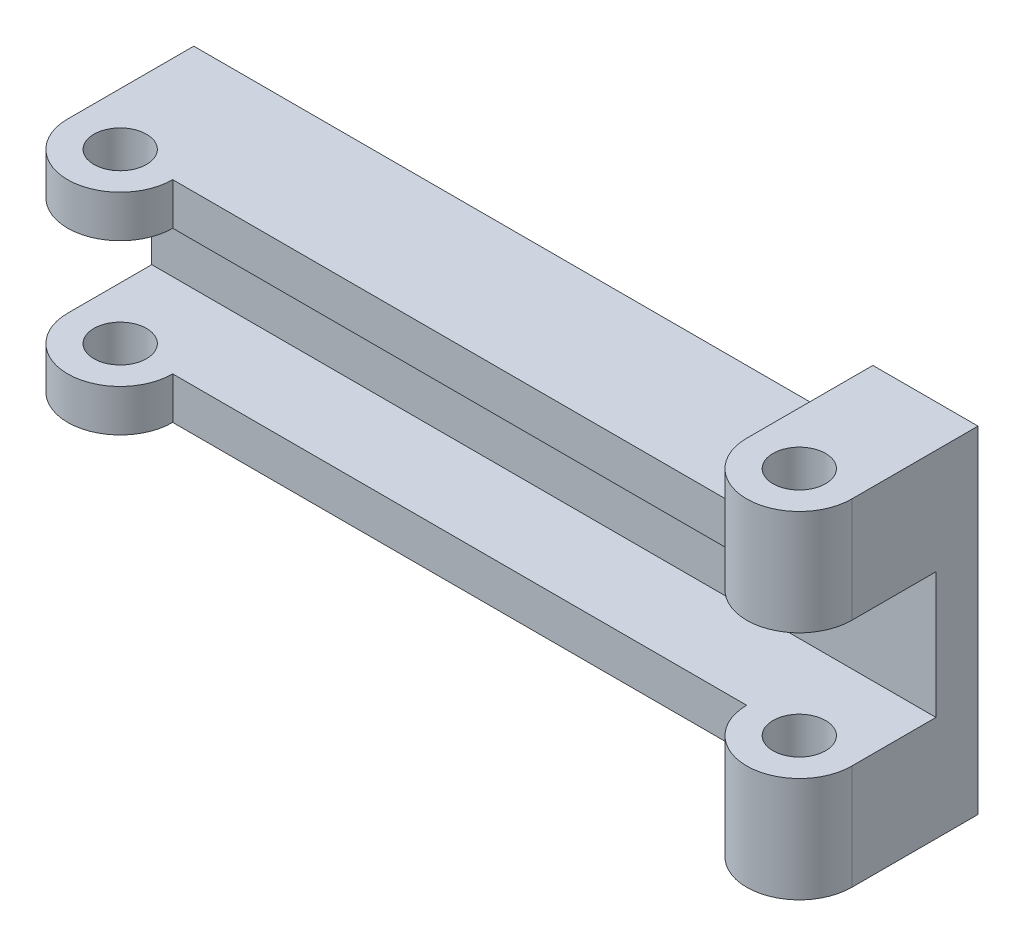
ISO-10303-21;
HEADER;
FILE_DESCRIPTION(('STEP AP214'),'2;1');
FILE_NAME('part.step','',(''),(''),'','','');
FILE_SCHEMA(('AUTOMOTIVE_DESIGN { 1 0 10303 214 1 1 1 1 }'));
ENDSEC;
DATA;
#1=APPLICATION_CONTEXT('core data for automotive mechanical design processes');
#2=APPLICATION_PROTOCOL_DEFINITION('international standard','automotive_design',2000,#1);
#3=PRODUCT_CONTEXT('',#1,'mechanical');
#4=PRODUCT('Part','Part','',(#3));
#5=PRODUCT_RELATED_PRODUCT_CATEGORY('part','',(#4));
#6=PRODUCT_DEFINITION_FORMATION('','',#4);
#7=PRODUCT_DEFINITION_CONTEXT('part definition',#1,'design');
#8=PRODUCT_DEFINITION('design','',#6,#7);
#9=PRODUCT_DEFINITION_SHAPE('','',#8);
#10=(LENGTH_UNIT() NAMED_UNIT(*) SI_UNIT(.MILLI.,.METRE.));
#11=(NAMED_UNIT(*) PLANE_ANGLE_UNIT() SI_UNIT($,.RADIAN.));
#12=(NAMED_UNIT(*) SI_UNIT($,.STERADIAN.) SOLID_ANGLE_UNIT());
#13=UNCERTAINTY_MEASURE_WITH_UNIT(LENGTH_MEASURE(1.E-05),#10,'distance_accuracy_value','');
#14=(GEOMETRIC_REPRESENTATION_CONTEXT(3) GLOBAL_UNCERTAINTY_ASSIGNED_CONTEXT((#13)) GLOBAL_UNIT_ASSIGNED_CONTEXT((#10,
#11,#12)) REPRESENTATION_CONTEXT('',''));
#15=CARTESIAN_POINT('',(0.,0.,0.));
#16=DIRECTION('',(0.,0.,1.));
#17=DIRECTION('',(1.,0.,0.));
#18=AXIS2_PLACEMENT_3D('',#15,#16,#17);
#19=CARTESIAN_POINT('',(102.5525,-15.875,6.35));
#20=DIRECTION('',(1.,0.,0.));
#21=DIRECTION('',(0.,0.,-1.));
#22=AXIS2_PLACEMENT_3D('',#19,#20,#21);
#23=PLANE('',#22);
#24=DIRECTION('',(0.,-1.,0.));
#25=VECTOR('',#24,1.);
#26=CARTESIAN_POINT('',(102.5525,-9.525,19.05));
#27=LINE('',#26,#25);
#28=CARTESIAN_POINT('',(102.5525,-15.875,19.05));
#29=VERTEX_POINT('',#28);
#30=CARTESIAN_POINT('',(102.5525,-25.4,19.05));
#31=VERTEX_POINT('',#30);
#32=EDGE_CURVE('E307',#29,#31,#27,.T.);
#33=ORIENTED_EDGE('',*,*,#32,.F.);
#34=DIRECTION('',(0.,0.,-1.));
#35=VECTOR('',#34,1.);
#36=CARTESIAN_POINT('',(102.5525,-15.875,6.35));
#37=LINE('',#36,#35);
#38=CARTESIAN_POINT('',(102.5525,-15.875,0.));
#39=VERTEX_POINT('',#38);
#40=EDGE_CURVE('E48',#29,#39,#37,.T.);
#41=ORIENTED_EDGE('',*,*,#40,.T.);
#42=DIRECTION('',(0.,-1.,0.));
#43=VECTOR('',#42,1.);
#44=CARTESIAN_POINT('',(102.5525,-15.875,0.));
#45=LINE('',#44,#43);
#46=CARTESIAN_POINT('',(102.5525,-25.4,0.));
#47=VERTEX_POINT('',#46);
#48=EDGE_CURVE('E327',#39,#47,#45,.T.);
#49=ORIENTED_EDGE('',*,*,#48,.T.);
#50=DIRECTION('',(0.,0.,-1.));
#51=VECTOR('',#50,1.);
#52=CARTESIAN_POINT('',(102.5525,-25.4,6.35));
#53=LINE('',#52,#51);
#54=EDGE_CURVE('E335',#31,#47,#53,.T.);
#55=ORIENTED_EDGE('',*,*,#54,.F.);
#56=EDGE_LOOP('',(#33,#41,#49,#55));
#57=FACE_BOUND('',#56,.T.);
#58=ADVANCED_FACE('F39',(#57),#23,.F.);
#59=CARTESIAN_POINT('',(118.4275,-25.4,6.35));
#60=DIRECTION('',(-1.,0.,0.));
#61=DIRECTION('',(0.,0.,1.));
#62=AXIS2_PLACEMENT_3D('',#59,#60,#61);
#63=PLANE('',#62);
#64=DIRECTION('',(0.,1.,0.));
#65=VECTOR('',#64,1.);
#66=CARTESIAN_POINT('',(118.4275,-25.4,0.));
#67=LINE('',#66,#65);
#68=CARTESIAN_POINT('',(118.4275,-25.4,0.));
#69=VERTEX_POINT('',#68);
#70=CARTESIAN_POINT('',(118.4275,25.4,0.));
#71=VERTEX_POINT('',#70);
#72=EDGE_CURVE('E306',#69,#71,#67,.T.);
#73=ORIENTED_EDGE('',*,*,#72,.T.);
#74=DIRECTION('',(0.,0.,-1.));
#75=VECTOR('',#74,1.);
#76=CARTESIAN_POINT('',(118.4275,25.4,6.35));
#77=LINE('',#76,#75);
#78=CARTESIAN_POINT('',(118.4275,25.4,19.05));
#79=VERTEX_POINT('',#78);
#80=EDGE_CURVE('E230',#79,#71,#77,.T.);
#81=ORIENTED_EDGE('',*,*,#80,.F.);
#82=DIRECTION('',(0.,1.,0.));
#83=VECTOR('',#82,1.);
#84=CARTESIAN_POINT('',(118.4275,9.525,19.05));
#85=LINE('',#84,#83);
#86=CARTESIAN_POINT('',(118.4275,9.525,19.05));
#87=VERTEX_POINT('',#86);
#88=EDGE_CURVE('E209',#87,#79,#85,.T.);
#89=ORIENTED_EDGE('',*,*,#88,.F.);
#90=DIRECTION('',(0.,0.,1.));
#91=VECTOR('',#90,1.);
#92=CARTESIAN_POINT('',(118.4275,9.525,19.05));
#93=LINE('',#92,#91);
#94=CARTESIAN_POINT('',(118.4275,9.525,6.35));
#95=VERTEX_POINT('',#94);
#96=EDGE_CURVE('E204',#95,#87,#93,.T.);
#97=ORIENTED_EDGE('',*,*,#96,.F.);
#98=DIRECTION('',(0.,1.,0.));
#99=VECTOR('',#98,1.);
#100=CARTESIAN_POINT('',(118.4275,-25.4,6.35));
#101=LINE('',#100,#99);
#102=CARTESIAN_POINT('',(118.4275,-9.525,6.35));
#103=VERTEX_POINT('',#102);
#104=EDGE_CURVE('E311',#103,#95,#101,.T.);
#105=ORIENTED_EDGE('',*,*,#104,.F.);
#106=DIRECTION('',(0.,0.,1.));
#107=VECTOR('',#106,1.);
#108=CARTESIAN_POINT('',(118.4275,-9.525,19.05));
#109=LINE('',#108,#107);
#110=CARTESIAN_POINT('',(118.4275,-9.525,19.05));
#111=VERTEX_POINT('',#110);
#112=EDGE_CURVE('E291',#103,#111,#109,.T.);
#113=ORIENTED_EDGE('',*,*,#112,.T.);
#114=DIRECTION('',(0.,-1.,0.));
#115=VECTOR('',#114,1.);
#116=CARTESIAN_POINT('',(118.4275,-9.525,19.05));
#117=LINE('',#116,#115);
#118=CARTESIAN_POINT('',(118.4275,-25.4,19.05));
#119=VERTEX_POINT('',#118);
#120=EDGE_CURVE('E298',#111,#119,#117,.T.);
#121=ORIENTED_EDGE('',*,*,#120,.T.);
#122=DIRECTION('',(0.,0.,-1.));
#123=VECTOR('',#122,1.);
#124=CARTESIAN_POINT('',(118.4275,-25.4,6.35));
#125=LINE('',#124,#123);
#126=EDGE_CURVE('E318',#119,#69,#125,.T.);
#127=ORIENTED_EDGE('',*,*,#126,.T.);
#128=EDGE_LOOP('',(#73,#81,#89,#97,#105,#113,#121,#127));
#129=FACE_BOUND('',#128,.T.);
#130=ADVANCED_FACE('F41',(#129),#63,.F.);
#131=CARTESIAN_POINT('',(0.,0.,6.35));
#132=DIRECTION('',(1.,0.,0.));
#133=DIRECTION('',(0.,1.,0.));
#134=AXIS2_PLACEMENT_3D('',#131,#132,#133);
#135=PLANE('',#134);
#136=DIRECTION('',(0.,-1.,0.));
#137=VECTOR('',#136,1.);
#138=CARTESIAN_POINT('',(0.,0.,0.));
#139=LINE('',#138,#137);
#140=CARTESIAN_POINT('',(0.,15.875,0.));
#141=VERTEX_POINT('',#140);
#142=CARTESIAN_POINT('',(0.,-15.875,0.));
#143=VERTEX_POINT('',#142);
#144=EDGE_CURVE('E321',#141,#143,#139,.T.);
#145=ORIENTED_EDGE('',*,*,#144,.T.);
#146=DIRECTION('',(0.,0.,-1.));
#147=VECTOR('',#146,1.);
#148=CARTESIAN_POINT('',(0.,-15.875,6.35));
#149=LINE('',#148,#147);
#150=CARTESIAN_POINT('',(0.,-15.875,19.05));
#151=VERTEX_POINT('',#150);
#152=EDGE_CURVE('E11',#151,#143,#149,.T.);
#153=ORIENTED_EDGE('',*,*,#152,.F.);
#154=DIRECTION('',(0.,-1.,0.));
#155=VECTOR('',#154,1.);
#156=CARTESIAN_POINT('',(0.,-9.525,19.05));
#157=LINE('',#156,#155);
#158=CARTESIAN_POINT('',(0.,-9.525,19.05));
#159=VERTEX_POINT('',#158);
#160=EDGE_CURVE('E274',#159,#151,#157,.T.);
#161=ORIENTED_EDGE('',*,*,#160,.F.);
#162=DIRECTION('',(0.,0.,-1.));
#163=VECTOR('',#162,1.);
#164=CARTESIAN_POINT('',(0.,-9.525,6.35));
#165=LINE('',#164,#163);
#166=CARTESIAN_POINT('',(0.,-9.525,6.35));
#167=VERTEX_POINT('',#166);
#168=EDGE_CURVE('E264',#159,#167,#165,.T.);
#169=ORIENTED_EDGE('',*,*,#168,.T.);
#170=DIRECTION('',(0.,-1.,0.));
#171=VECTOR('',#170,1.);
#172=CARTESIAN_POINT('',(0.,0.,6.35));
#173=LINE('',#172,#171);
#174=CARTESIAN_POINT('',(0.,9.525,6.35));
#175=VERTEX_POINT('',#174);
#176=EDGE_CURVE('E314',#175,#167,#173,.T.);
#177=ORIENTED_EDGE('',*,*,#176,.F.);
#178=DIRECTION('',(0.,0.,-1.));
#179=VECTOR('',#178,1.);
#180=CARTESIAN_POINT('',(0.,9.525,6.35));
#181=LINE('',#180,#179);
#182=CARTESIAN_POINT('',(0.,9.525,19.05));
#183=VERTEX_POINT('',#182);
#184=EDGE_CURVE('E159',#183,#175,#181,.T.);
#185=ORIENTED_EDGE('',*,*,#184,.F.);
#186=DIRECTION('',(0.,1.,0.));
#187=VECTOR('',#186,1.);
#188=CARTESIAN_POINT('',(0.,9.525,19.05));
#189=LINE('',#188,#187);
#190=CARTESIAN_POINT('',(0.,15.875,19.05));
#191=VERTEX_POINT('',#190);
#192=EDGE_CURVE('E158',#183,#191,#189,.T.);
#193=ORIENTED_EDGE('',*,*,#192,.T.);
#194=DIRECTION('',(0.,0.,-1.));
#195=VECTOR('',#194,1.);
#196=CARTESIAN_POINT('',(0.,15.875,6.35));
#197=LINE('',#196,#195);
#198=EDGE_CURVE('E242',#191,#141,#197,.T.);
#199=ORIENTED_EDGE('',*,*,#198,.T.);
#200=EDGE_LOOP('',(#145,#153,#161,#169,#177,#185,#193,#199));
#201=FACE_BOUND('',#200,.T.);
#202=ADVANCED_FACE('F380',(#201),#135,.F.);
#203=CARTESIAN_POINT('',(0.,-15.875,6.35));
#204=DIRECTION('',(0.,1.,0.));
#205=DIRECTION('',(0.,0.,1.));
#206=AXIS2_PLACEMENT_3D('',#203,#204,#205);
#207=PLANE('',#206);
#208=DIRECTION('',(1.,0.,0.));
#209=VECTOR('',#208,1.);
#210=CARTESIAN_POINT('',(0.,-15.875,0.));
#211=LINE('',#210,#209);
#212=EDGE_CURVE('E324',#143,#39,#211,.T.);
#213=ORIENTED_EDGE('',*,*,#212,.T.);
#214=ORIENTED_EDGE('',*,*,#40,.F.);
#215=DIRECTION('',(-1.,0.,0.));
#216=VECTOR('',#215,1.);
#217=CARTESIAN_POINT('',(15.875,-15.875,19.05));
#218=LINE('',#217,#216);
#219=CARTESIAN_POINT('',(15.875,-15.875,19.05));
#220=VERTEX_POINT('',#219);
#221=EDGE_CURVE('E251',#29,#220,#218,.T.);
#222=ORIENTED_EDGE('',*,*,#221,.T.);
#223=CARTESIAN_POINT('',(7.9375,-15.875,19.05));
#224=DIRECTION('',(0.,-1.,0.));
#225=DIRECTION('',(0.,0.,1.));
#226=AXIS2_PLACEMENT_3D('',#223,#224,#225);
#227=CIRCLE('',#226,7.9375);
#228=EDGE_CURVE('E260',#220,#151,#227,.T.);
#229=ORIENTED_EDGE('',*,*,#228,.T.);
#230=ORIENTED_EDGE('',*,*,#152,.T.);
#231=EDGE_LOOP('',(#213,#214,#222,#229,#230));
#232=FACE_BOUND('',#231,.T.);
#233=CARTESIAN_POINT('',(7.9375,-15.875,19.05));
#234=DIRECTION('',(0.,-1.,0.));
#235=DIRECTION('',(0.,0.,-1.));
#236=AXIS2_PLACEMENT_3D('',#233,#234,#235);
#237=CIRCLE('',#236,3.96875);
#238=CARTESIAN_POINT('',(7.9375,-15.875,15.08125));
#239=VERTEX_POINT('',#238);
#240=EDGE_CURVE('E246',#239,#239,#237,.T.);
#241=ORIENTED_EDGE('',*,*,#240,.F.);
#242=EDGE_LOOP('',(#241));
#243=FACE_BOUND('',#242,.T.);
#244=ADVANCED_FACE('F393',(#232,#243),#207,.F.);
#245=CARTESIAN_POINT('',(102.5525,-25.4,6.35));
#246=DIRECTION('',(0.,1.,0.));
#247=DIRECTION('',(0.,0.,1.));
#248=AXIS2_PLACEMENT_3D('',#245,#246,#247);
#249=PLANE('',#248);
#250=DIRECTION('',(1.,0.,0.));
#251=VECTOR('',#250,1.);
#252=CARTESIAN_POINT('',(102.5525,-25.4,0.));
#253=LINE('',#252,#251);
#254=EDGE_CURVE('E315',#47,#69,#253,.T.);
#255=ORIENTED_EDGE('',*,*,#254,.T.);
#256=ORIENTED_EDGE('',*,*,#126,.F.);
#257=CARTESIAN_POINT('',(110.49,-25.4,19.05));
#258=DIRECTION('',(0.,-1.,0.));
#259=DIRECTION('',(0.,0.,1.));
#260=AXIS2_PLACEMENT_3D('',#257,#258,#259);
#261=CIRCLE('',#260,7.9375);
#262=EDGE_CURVE('E285',#119,#31,#261,.T.);
#263=ORIENTED_EDGE('',*,*,#262,.T.);
#264=ORIENTED_EDGE('',*,*,#54,.T.);
#265=EDGE_LOOP('',(#255,#256,#263,#264));
#266=FACE_BOUND('',#265,.T.);
#267=CARTESIAN_POINT('',(110.49,-25.4,19.05));
#268=DIRECTION('',(0.,-1.,0.));
#269=DIRECTION('',(0.,0.,-1.));
#270=AXIS2_PLACEMENT_3D('',#267,#268,#269);
#271=CIRCLE('',#270,3.96874999999999);
#272=CARTESIAN_POINT('',(110.49,-25.4,15.08125));
#273=VERTEX_POINT('',#272);
#274=EDGE_CURVE('E278',#273,#273,#271,.T.);
#275=ORIENTED_EDGE('',*,*,#274,.F.);
#276=EDGE_LOOP('',(#275));
#277=FACE_BOUND('',#276,.T.);
#278=ADVANCED_FACE('F348',(#266,#277),#249,.F.);
#279=CARTESIAN_POINT('',(0.,0.,6.35));
#280=DIRECTION('',(0.,0.,1.));
#281=DIRECTION('',(1.,0.,0.));
#282=AXIS2_PLACEMENT_3D('',#279,#280,#281);
#283=PLANE('',#282);
#284=ORIENTED_EDGE('',*,*,#176,.T.);
#285=DIRECTION('',(1.,0.,0.));
#286=VECTOR('',#285,1.);
#287=CARTESIAN_POINT('',(118.4275,-9.525,6.35));
#288=LINE('',#287,#286);
#289=EDGE_CURVE('E55',#167,#103,#288,.T.);
#290=ORIENTED_EDGE('',*,*,#289,.T.);
#291=ORIENTED_EDGE('',*,*,#104,.T.);
#292=DIRECTION('',(1.,0.,0.));
#293=VECTOR('',#292,1.);
#294=CARTESIAN_POINT('',(118.4275,9.525,6.35));
#295=LINE('',#294,#293);
#296=EDGE_CURVE('E201',#175,#95,#295,.T.);
#297=ORIENTED_EDGE('',*,*,#296,.F.);
#298=EDGE_LOOP('',(#284,#290,#291,#297));
#299=FACE_BOUND('',#298,.T.);
#300=ADVANCED_FACE('F384',(#299),#283,.T.);
#301=CARTESIAN_POINT('',(0.,0.,0.));
#302=DIRECTION('',(0.,0.,1.));
#303=DIRECTION('',(1.,0.,0.));
#304=AXIS2_PLACEMENT_3D('',#301,#302,#303);
#305=PLANE('',#304);
#306=ORIENTED_EDGE('',*,*,#72,.F.);
#307=ORIENTED_EDGE('',*,*,#254,.F.);
#308=ORIENTED_EDGE('',*,*,#48,.F.);
#309=ORIENTED_EDGE('',*,*,#212,.F.);
#310=ORIENTED_EDGE('',*,*,#144,.F.);
#311=DIRECTION('',(1.,0.,0.));
#312=VECTOR('',#311,1.);
#313=CARTESIAN_POINT('',(0.,15.875,0.));
#314=LINE('',#313,#312);
#315=CARTESIAN_POINT('',(102.5525,15.875,0.));
#316=VERTEX_POINT('',#315);
#317=EDGE_CURVE('E215',#141,#316,#314,.T.);
#318=ORIENTED_EDGE('',*,*,#317,.T.);
#319=DIRECTION('',(0.,1.,0.));
#320=VECTOR('',#319,1.);
#321=CARTESIAN_POINT('',(102.5525,15.875,0.));
#322=LINE('',#321,#320);
#323=CARTESIAN_POINT('',(102.5525,25.4,0.));
#324=VERTEX_POINT('',#323);
#325=EDGE_CURVE('E222',#316,#324,#322,.T.);
#326=ORIENTED_EDGE('',*,*,#325,.T.);
#327=DIRECTION('',(1.,0.,0.));
#328=VECTOR('',#327,1.);
#329=CARTESIAN_POINT('',(102.5525,25.4,0.));
#330=LINE('',#329,#328);
#331=EDGE_CURVE('E226',#324,#71,#330,.T.);
#332=ORIENTED_EDGE('',*,*,#331,.T.);
#333=EDGE_LOOP('',(#306,#307,#308,#309,#310,#318,#326,#332));
#334=FACE_BOUND('',#333,.T.);
#335=ADVANCED_FACE('F346',(#334),#305,.F.);
#336=CARTESIAN_POINT('',(110.49,-9.525,19.05));
#337=DIRECTION('',(0.,-1.,0.));
#338=DIRECTION('',(0.,0.,-1.));
#339=AXIS2_PLACEMENT_3D('',#336,#337,#338);
#340=CYLINDRICAL_SURFACE('',#339,7.9375);
#341=ORIENTED_EDGE('',*,*,#262,.F.);
#342=ORIENTED_EDGE('',*,*,#120,.F.);
#343=CARTESIAN_POINT('',(110.49,-9.525,19.05));
#344=DIRECTION('',(0.,-1.,0.));
#345=DIRECTION('',(0.,0.,1.));
#346=AXIS2_PLACEMENT_3D('',#343,#344,#345);
#347=CIRCLE('',#346,7.9375);
#348=CARTESIAN_POINT('',(102.5525,-9.525,19.05));
#349=VERTEX_POINT('',#348);
#350=EDGE_CURVE('E295',#111,#349,#347,.T.);
#351=ORIENTED_EDGE('',*,*,#350,.T.);
#352=EDGE_CURVE('E302',#349,#29,#27,.T.);
#353=ORIENTED_EDGE('',*,*,#352,.T.);
#354=ORIENTED_EDGE('',*,*,#32,.T.);
#355=EDGE_LOOP('',(#341,#342,#351,#353,#354));
#356=FACE_BOUND('',#355,.T.);
#357=ADVANCED_FACE('F356',(#356),#340,.T.);
#358=CARTESIAN_POINT('',(110.49,-9.525,19.05));
#359=DIRECTION('',(0.,1.,0.));
#360=DIRECTION('',(0.,0.,1.));
#361=AXIS2_PLACEMENT_3D('',#358,#359,#360);
#362=PLANE('',#361);
#363=CARTESIAN_POINT('',(110.49,-9.525,19.05));
#364=DIRECTION('',(0.,-1.,0.));
#365=DIRECTION('',(0.,0.,-1.));
#366=AXIS2_PLACEMENT_3D('',#363,#364,#365);
#367=CIRCLE('',#366,3.96874999999999);
#368=CARTESIAN_POINT('',(110.49,-9.525,15.08125));
#369=VERTEX_POINT('',#368);
#370=EDGE_CURVE('E281',#369,#369,#367,.T.);
#371=ORIENTED_EDGE('',*,*,#370,.T.);
#372=EDGE_LOOP('',(#371));
#373=FACE_BOUND('',#372,.T.);
#374=ORIENTED_EDGE('',*,*,#289,.F.);
#375=ORIENTED_EDGE('',*,*,#168,.F.);
#376=CARTESIAN_POINT('',(7.9375,-9.525,19.05));
#377=DIRECTION('',(0.,-1.,0.));
#378=DIRECTION('',(0.,0.,1.));
#379=AXIS2_PLACEMENT_3D('',#376,#377,#378);
#380=CIRCLE('',#379,7.9375);
#381=CARTESIAN_POINT('',(15.875,-9.525,19.05));
#382=VERTEX_POINT('',#381);
#383=EDGE_CURVE('E259',#382,#159,#380,.T.);
#384=ORIENTED_EDGE('',*,*,#383,.F.);
#385=DIRECTION('',(-1.,0.,0.));
#386=VECTOR('',#385,1.);
#387=CARTESIAN_POINT('',(15.875,-9.525,19.05));
#388=LINE('',#387,#386);
#389=EDGE_CURVE('E255',#349,#382,#388,.T.);
#390=ORIENTED_EDGE('',*,*,#389,.F.);
#391=ORIENTED_EDGE('',*,*,#350,.F.);
#392=ORIENTED_EDGE('',*,*,#112,.F.);
#393=EDGE_LOOP('',(#374,#375,#384,#390,#391,#392));
#394=FACE_BOUND('',#393,.T.);
#395=CARTESIAN_POINT('',(7.9375,-9.525,19.05));
#396=DIRECTION('',(0.,-1.,0.));
#397=DIRECTION('',(0.,0.,-1.));
#398=AXIS2_PLACEMENT_3D('',#395,#396,#397);
#399=CIRCLE('',#398,3.96875);
#400=CARTESIAN_POINT('',(7.9375,-9.525,15.08125));
#401=VERTEX_POINT('',#400);
#402=EDGE_CURVE('E247',#401,#401,#399,.T.);
#403=ORIENTED_EDGE('',*,*,#402,.T.);
#404=EDGE_LOOP('',(#403));
#405=FACE_BOUND('',#404,.T.);
#406=ADVANCED_FACE('F386',(#373,#394,#405),#362,.T.);
#407=CARTESIAN_POINT('',(110.49,-9.525,19.05));
#408=DIRECTION('',(0.,-1.,0.));
#409=DIRECTION('',(0.,0.,-1.));
#410=AXIS2_PLACEMENT_3D('',#407,#408,#409);
#411=CYLINDRICAL_SURFACE('',#410,3.96874999999999);
#412=ORIENTED_EDGE('',*,*,#370,.F.);
#413=EDGE_LOOP('',(#412));
#414=FACE_BOUND('',#413,.T.);
#415=ORIENTED_EDGE('',*,*,#274,.T.);
#416=EDGE_LOOP('',(#415));
#417=FACE_BOUND('',#416,.T.);
#418=ADVANCED_FACE('F397',(#414,#417),#411,.F.);
#419=CARTESIAN_POINT('',(7.9375,-9.525,19.05));
#420=DIRECTION('',(0.,-1.,0.));
#421=DIRECTION('',(0.,0.,-1.));
#422=AXIS2_PLACEMENT_3D('',#419,#420,#421);
#423=CYLINDRICAL_SURFACE('',#422,7.9375);
#424=ORIENTED_EDGE('',*,*,#228,.F.);
#425=DIRECTION('',(0.,-1.,0.));
#426=VECTOR('',#425,1.);
#427=CARTESIAN_POINT('',(15.875,-9.525,19.05));
#428=LINE('',#427,#426);
#429=EDGE_CURVE('E268',#382,#220,#428,.T.);
#430=ORIENTED_EDGE('',*,*,#429,.F.);
#431=ORIENTED_EDGE('',*,*,#383,.T.);
#432=ORIENTED_EDGE('',*,*,#160,.T.);
#433=EDGE_LOOP('',(#424,#430,#431,#432));
#434=FACE_BOUND('',#433,.T.);
#435=ADVANCED_FACE('F395',(#434),#423,.T.);
#436=CARTESIAN_POINT('',(15.875,-9.525,19.05));
#437=DIRECTION('',(0.,0.,1.));
#438=DIRECTION('',(1.,0.,0.));
#439=AXIS2_PLACEMENT_3D('',#436,#437,#438);
#440=PLANE('',#439);
#441=ORIENTED_EDGE('',*,*,#221,.F.);
#442=ORIENTED_EDGE('',*,*,#352,.F.);
#443=ORIENTED_EDGE('',*,*,#389,.T.);
#444=ORIENTED_EDGE('',*,*,#429,.T.);
#445=EDGE_LOOP('',(#441,#442,#443,#444));
#446=FACE_BOUND('',#445,.T.);
#447=ADVANCED_FACE('F391',(#446),#440,.T.);
#448=CARTESIAN_POINT('',(7.9375,-9.525,19.05));
#449=DIRECTION('',(0.,-1.,0.));
#450=DIRECTION('',(0.,0.,-1.));
#451=AXIS2_PLACEMENT_3D('',#448,#449,#450);
#452=CYLINDRICAL_SURFACE('',#451,3.96875);
#453=ORIENTED_EDGE('',*,*,#402,.F.);
#454=EDGE_LOOP('',(#453));
#455=FACE_BOUND('',#454,.T.);
#456=ORIENTED_EDGE('',*,*,#240,.T.);
#457=EDGE_LOOP('',(#456));
#458=FACE_BOUND('',#457,.T.);
#459=ADVANCED_FACE('F403',(#455,#458),#452,.F.);
#460=CARTESIAN_POINT('',(102.5525,15.875,6.35));
#461=DIRECTION('',(1.,0.,0.));
#462=DIRECTION('',(0.,0.,-1.));
#463=AXIS2_PLACEMENT_3D('',#460,#461,#462);
#464=PLANE('',#463);
#465=DIRECTION('',(0.,1.,0.));
#466=VECTOR('',#465,1.);
#467=CARTESIAN_POINT('',(102.5525,9.525,19.05));
#468=LINE('',#467,#466);
#469=CARTESIAN_POINT('',(102.5525,15.875,19.05));
#470=VERTEX_POINT('',#469);
#471=CARTESIAN_POINT('',(102.5525,25.4,19.05));
#472=VERTEX_POINT('',#471);
#473=EDGE_CURVE('E216',#470,#472,#468,.T.);
#474=ORIENTED_EDGE('',*,*,#473,.T.);
#475=DIRECTION('',(0.,0.,-1.));
#476=VECTOR('',#475,1.);
#477=CARTESIAN_POINT('',(102.5525,25.4,6.35));
#478=LINE('',#477,#476);
#479=EDGE_CURVE('E234',#472,#324,#478,.T.);
#480=ORIENTED_EDGE('',*,*,#479,.T.);
#481=ORIENTED_EDGE('',*,*,#325,.F.);
#482=DIRECTION('',(0.,0.,-1.));
#483=VECTOR('',#482,1.);
#484=CARTESIAN_POINT('',(102.5525,15.875,6.35));
#485=LINE('',#484,#483);
#486=EDGE_CURVE('E238',#470,#316,#485,.T.);
#487=ORIENTED_EDGE('',*,*,#486,.F.);
#488=EDGE_LOOP('',(#474,#480,#481,#487));
#489=FACE_BOUND('',#488,.T.);
#490=ADVANCED_FACE('F365',(#489),#464,.F.);
#491=CARTESIAN_POINT('',(0.,15.875,6.35));
#492=DIRECTION('',(0.,-1.,0.));
#493=DIRECTION('',(0.,0.,1.));
#494=AXIS2_PLACEMENT_3D('',#491,#492,#493);
#495=PLANE('',#494);
#496=ORIENTED_EDGE('',*,*,#317,.F.);
#497=ORIENTED_EDGE('',*,*,#198,.F.);
#498=CARTESIAN_POINT('',(7.9375,15.875,19.05));
#499=DIRECTION('',(0.,-1.,0.));
#500=DIRECTION('',(0.,0.,1.));
#501=AXIS2_PLACEMENT_3D('',#498,#499,#500);
#502=CIRCLE('',#501,7.9375);
#503=CARTESIAN_POINT('',(15.875,15.875,19.05));
#504=VERTEX_POINT('',#503);
#505=EDGE_CURVE('E177',#504,#191,#502,.T.);
#506=ORIENTED_EDGE('',*,*,#505,.F.);
#507=DIRECTION('',(-1.,0.,0.));
#508=VECTOR('',#507,1.);
#509=CARTESIAN_POINT('',(15.875,15.875,19.05));
#510=LINE('',#509,#508);
#511=EDGE_CURVE('E154',#470,#504,#510,.T.);
#512=ORIENTED_EDGE('',*,*,#511,.F.);
#513=ORIENTED_EDGE('',*,*,#486,.T.);
#514=EDGE_LOOP('',(#496,#497,#506,#512,#513));
#515=FACE_BOUND('',#514,.T.);
#516=CARTESIAN_POINT('',(7.9375,15.875,19.05));
#517=DIRECTION('',(0.,-1.,0.));
#518=DIRECTION('',(0.,0.,-1.));
#519=AXIS2_PLACEMENT_3D('',#516,#517,#518);
#520=CIRCLE('',#519,3.96875);
#521=CARTESIAN_POINT('',(7.9375,15.875,15.08125));
#522=VERTEX_POINT('',#521);
#523=EDGE_CURVE('E182',#522,#522,#520,.T.);
#524=ORIENTED_EDGE('',*,*,#523,.T.);
#525=EDGE_LOOP('',(#524));
#526=FACE_BOUND('',#525,.T.);
#527=ADVANCED_FACE('F377',(#515,#526),#495,.F.);
#528=CARTESIAN_POINT('',(102.5525,25.4,6.35));
#529=DIRECTION('',(0.,-1.,0.));
#530=DIRECTION('',(0.,0.,1.));
#531=AXIS2_PLACEMENT_3D('',#528,#529,#530);
#532=PLANE('',#531);
#533=ORIENTED_EDGE('',*,*,#331,.F.);
#534=ORIENTED_EDGE('',*,*,#479,.F.);
#535=CARTESIAN_POINT('',(110.49,25.4,19.05));
#536=DIRECTION('',(0.,-1.,0.));
#537=DIRECTION('',(0.,0.,1.));
#538=AXIS2_PLACEMENT_3D('',#535,#536,#537);
#539=CIRCLE('',#538,7.9375);
#540=EDGE_CURVE('E197',#79,#472,#539,.T.);
#541=ORIENTED_EDGE('',*,*,#540,.F.);
#542=ORIENTED_EDGE('',*,*,#80,.T.);
#543=EDGE_LOOP('',(#533,#534,#541,#542));
#544=FACE_BOUND('',#543,.T.);
#545=CARTESIAN_POINT('',(110.49,25.4,19.05));
#546=DIRECTION('',(0.,-1.,0.));
#547=DIRECTION('',(0.,0.,-1.));
#548=AXIS2_PLACEMENT_3D('',#545,#546,#547);
#549=CIRCLE('',#548,3.96874999999999);
#550=CARTESIAN_POINT('',(110.49,25.4,15.08125));
#551=VERTEX_POINT('',#550);
#552=EDGE_CURVE('E191',#551,#551,#549,.T.);
#553=ORIENTED_EDGE('',*,*,#552,.T.);
#554=EDGE_LOOP('',(#553));
#555=FACE_BOUND('',#554,.T.);
#556=ADVANCED_FACE('F372',(#544,#555),#532,.F.);
#557=CARTESIAN_POINT('',(110.49,9.525,19.05));
#558=DIRECTION('',(0.,1.,0.));
#559=DIRECTION('',(0.,0.,-1.));
#560=AXIS2_PLACEMENT_3D('',#557,#558,#559);
#561=CYLINDRICAL_SURFACE('',#560,7.9375);
#562=ORIENTED_EDGE('',*,*,#540,.T.);
#563=ORIENTED_EDGE('',*,*,#473,.F.);
#564=CARTESIAN_POINT('',(102.5525,9.525,19.05));
#565=VERTEX_POINT('',#564);
#566=EDGE_CURVE('E212',#565,#470,#468,.T.);
#567=ORIENTED_EDGE('',*,*,#566,.F.);
#568=CARTESIAN_POINT('',(110.49,9.525,19.05));
#569=DIRECTION('',(0.,-1.,0.));
#570=DIRECTION('',(0.,0.,1.));
#571=AXIS2_PLACEMENT_3D('',#568,#569,#570);
#572=CIRCLE('',#571,7.9375);
#573=EDGE_CURVE('E174',#87,#565,#572,.T.);
#574=ORIENTED_EDGE('',*,*,#573,.F.);
#575=ORIENTED_EDGE('',*,*,#88,.T.);
#576=EDGE_LOOP('',(#562,#563,#567,#574,#575));
#577=FACE_BOUND('',#576,.T.);
#578=ADVANCED_FACE('F369',(#577),#561,.T.);
#579=CARTESIAN_POINT('',(110.49,9.525,19.05));
#580=DIRECTION('',(0.,-1.,0.));
#581=DIRECTION('',(0.,0.,1.));
#582=AXIS2_PLACEMENT_3D('',#579,#580,#581);
#583=PLANE('',#582);
#584=CARTESIAN_POINT('',(110.49,9.525,19.05));
#585=DIRECTION('',(0.,-1.,0.));
#586=DIRECTION('',(0.,0.,-1.));
#587=AXIS2_PLACEMENT_3D('',#584,#585,#586);
#588=CIRCLE('',#587,3.96874999999999);
#589=CARTESIAN_POINT('',(110.49,9.525,15.08125));
#590=VERTEX_POINT('',#589);
#591=EDGE_CURVE('E193',#590,#590,#588,.T.);
#592=ORIENTED_EDGE('',*,*,#591,.F.);
#593=EDGE_LOOP('',(#592));
#594=FACE_BOUND('',#593,.T.);
#595=ORIENTED_EDGE('',*,*,#296,.T.);
#596=ORIENTED_EDGE('',*,*,#96,.T.);
#597=ORIENTED_EDGE('',*,*,#573,.T.);
#598=DIRECTION('',(-1.,0.,0.));
#599=VECTOR('',#598,1.);
#600=CARTESIAN_POINT('',(15.875,9.525,19.05));
#601=LINE('',#600,#599);
#602=CARTESIAN_POINT('',(15.875,9.525,19.05));
#603=VERTEX_POINT('',#602);
#604=EDGE_CURVE('E151',#565,#603,#601,.T.);
#605=ORIENTED_EDGE('',*,*,#604,.T.);
#606=CARTESIAN_POINT('',(7.9375,9.525,19.05));
#607=DIRECTION('',(0.,-1.,0.));
#608=DIRECTION('',(0.,0.,1.));
#609=AXIS2_PLACEMENT_3D('',#606,#607,#608);
#610=CIRCLE('',#609,7.9375);
#611=EDGE_CURVE('E162',#603,#183,#610,.T.);
#612=ORIENTED_EDGE('',*,*,#611,.T.);
#613=ORIENTED_EDGE('',*,*,#184,.T.);
#614=EDGE_LOOP('',(#595,#596,#597,#605,#612,#613));
#615=FACE_BOUND('',#614,.T.);
#616=CARTESIAN_POINT('',(7.9375,9.525,19.05));
#617=DIRECTION('',(0.,-1.,0.));
#618=DIRECTION('',(0.,0.,-1.));
#619=AXIS2_PLACEMENT_3D('',#616,#617,#618);
#620=CIRCLE('',#619,3.96875);
#621=CARTESIAN_POINT('',(7.9375,9.525,15.08125));
#622=VERTEX_POINT('',#621);
#623=EDGE_CURVE('E188',#622,#622,#620,.T.);
#624=ORIENTED_EDGE('',*,*,#623,.F.);
#625=EDGE_LOOP('',(#624));
#626=FACE_BOUND('',#625,.T.);
#627=ADVANCED_FACE('F171',(#594,#615,#626),#583,.T.);
#628=CARTESIAN_POINT('',(110.49,9.525,19.05));
#629=DIRECTION('',(0.,1.,0.));
#630=DIRECTION('',(0.,0.,-1.));
#631=AXIS2_PLACEMENT_3D('',#628,#629,#630);
#632=CYLINDRICAL_SURFACE('',#631,3.96874999999999);
#633=ORIENTED_EDGE('',*,*,#591,.T.);
#634=EDGE_LOOP('',(#633));
#635=FACE_BOUND('',#634,.T.);
#636=ORIENTED_EDGE('',*,*,#552,.F.);
#637=EDGE_LOOP('',(#636));
#638=FACE_BOUND('',#637,.T.);
#639=ADVANCED_FACE('F568',(#635,#638),#632,.F.);
#640=CARTESIAN_POINT('',(7.9375,9.525,19.05));
#641=DIRECTION('',(0.,1.,0.));
#642=DIRECTION('',(0.,0.,-1.));
#643=AXIS2_PLACEMENT_3D('',#640,#641,#642);
#644=CYLINDRICAL_SURFACE('',#643,7.9375);
#645=ORIENTED_EDGE('',*,*,#505,.T.);
#646=ORIENTED_EDGE('',*,*,#192,.F.);
#647=ORIENTED_EDGE('',*,*,#611,.F.);
#648=DIRECTION('',(0.,1.,0.));
#649=VECTOR('',#648,1.);
#650=CARTESIAN_POINT('',(15.875,9.525,19.05));
#651=LINE('',#650,#649);
#652=EDGE_CURVE('E147',#603,#504,#651,.T.);
#653=ORIENTED_EDGE('',*,*,#652,.T.);
#654=EDGE_LOOP('',(#645,#646,#647,#653));
#655=FACE_BOUND('',#654,.T.);
#656=ADVANCED_FACE('F163',(#655),#644,.T.);
#657=CARTESIAN_POINT('',(15.875,9.525,19.05));
#658=DIRECTION('',(0.,0.,1.));
#659=DIRECTION('',(1.,0.,0.));
#660=AXIS2_PLACEMENT_3D('',#657,#658,#659);
#661=PLANE('',#660);
#662=ORIENTED_EDGE('',*,*,#511,.T.);
#663=ORIENTED_EDGE('',*,*,#652,.F.);
#664=ORIENTED_EDGE('',*,*,#604,.F.);
#665=ORIENTED_EDGE('',*,*,#566,.T.);
#666=EDGE_LOOP('',(#662,#663,#664,#665));
#667=FACE_BOUND('',#666,.T.);
#668=ADVANCED_FACE('F149',(#667),#661,.T.);
#669=CARTESIAN_POINT('',(7.9375,9.525,19.05));
#670=DIRECTION('',(0.,1.,0.));
#671=DIRECTION('',(0.,0.,-1.));
#672=AXIS2_PLACEMENT_3D('',#669,#670,#671);
#673=CYLINDRICAL_SURFACE('',#672,3.96875);
#674=ORIENTED_EDGE('',*,*,#623,.T.);
#675=EDGE_LOOP('',(#674));
#676=FACE_BOUND('',#675,.T.);
#677=ORIENTED_EDGE('',*,*,#523,.F.);
#678=EDGE_LOOP('',(#677));
#679=FACE_BOUND('',#678,.T.);
#680=ADVANCED_FACE('F595',(#676,#679),#673,.F.);
#681=CLOSED_SHELL('',(#58,#130,#202,#244,#278,#300,#335,#357,#406,#418,#435,#447,#459,#490,#527,
#556,#578,#627,#639,#656,#668,#680));
#682=MANIFOLD_SOLID_BREP('B2',#681);
#683=ADVANCED_BREP_SHAPE_REPRESENTATION('',(#18,#682),#14);
#684=SHAPE_DEFINITION_REPRESENTATION(#9,#683);
ENDSEC;
END-ISO-10303-21;
